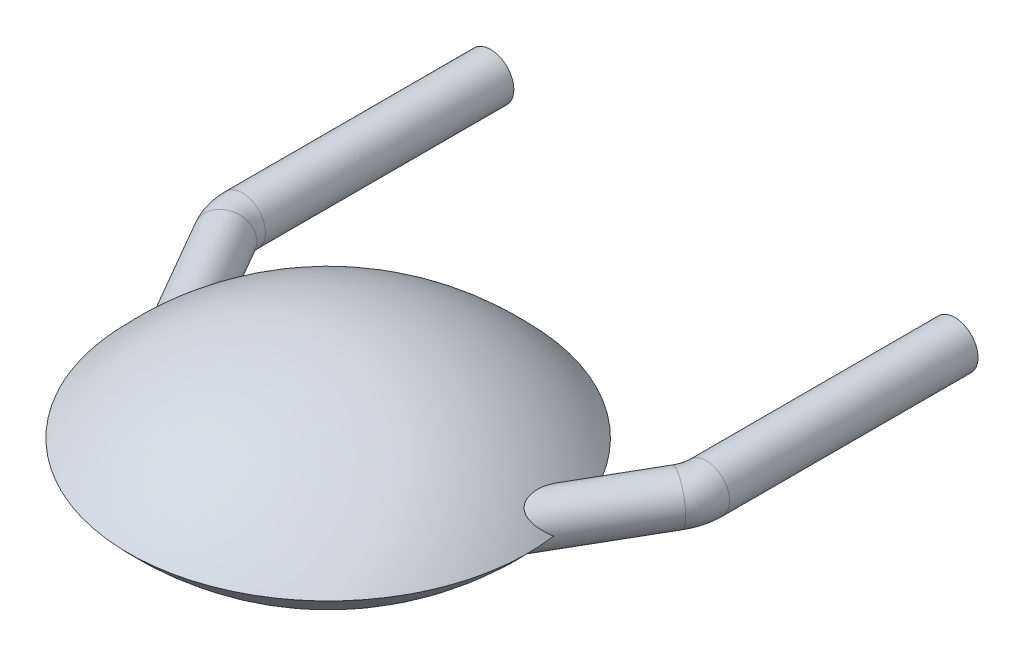
ISO-10303-21;
HEADER;
FILE_DESCRIPTION(('STEP AP214'),'2;1');
FILE_NAME('part.step','',(''),(''),'','','');
FILE_SCHEMA(('AUTOMOTIVE_DESIGN { 1 0 10303 214 1 1 1 1 }'));
ENDSEC;
DATA;
#1=APPLICATION_CONTEXT('core data for automotive mechanical design processes');
#2=APPLICATION_PROTOCOL_DEFINITION('international standard','automotive_design',2000,#1);
#3=PRODUCT_CONTEXT('',#1,'mechanical');
#4=PRODUCT('Part','Part','',(#3));
#5=PRODUCT_RELATED_PRODUCT_CATEGORY('part','',(#4));
#6=PRODUCT_DEFINITION_FORMATION('','',#4);
#7=PRODUCT_DEFINITION_CONTEXT('part definition',#1,'design');
#8=PRODUCT_DEFINITION('design','',#6,#7);
#9=PRODUCT_DEFINITION_SHAPE('','',#8);
#10=(LENGTH_UNIT() NAMED_UNIT(*) SI_UNIT(.MILLI.,.METRE.));
#11=(NAMED_UNIT(*) PLANE_ANGLE_UNIT() SI_UNIT($,.RADIAN.));
#12=(NAMED_UNIT(*) SI_UNIT($,.STERADIAN.) SOLID_ANGLE_UNIT());
#13=UNCERTAINTY_MEASURE_WITH_UNIT(LENGTH_MEASURE(1.E-05),#10,'distance_accuracy_value','');
#14=(GEOMETRIC_REPRESENTATION_CONTEXT(3) GLOBAL_UNCERTAINTY_ASSIGNED_CONTEXT((#13)) GLOBAL_UNIT_ASSIGNED_CONTEXT((#10,
#11,#12)) REPRESENTATION_CONTEXT('',''));
#15=CARTESIAN_POINT('',(0.,0.,0.));
#16=DIRECTION('',(0.,0.,1.));
#17=DIRECTION('',(1.,0.,0.));
#18=AXIS2_PLACEMENT_3D('',#15,#16,#17);
#19=CARTESIAN_POINT('',(0.,-0.25,-2.));
#20=DIRECTION('',(0.,0.,-1.));
#21=DIRECTION('',(-1.,0.,0.));
#22=AXIS2_PLACEMENT_3D('',#19,#20,#21);
#23=PLANE('',#22);
#24=CARTESIAN_POINT('',(0.,0.,-2.));
#25=DIRECTION('',(0.,0.,-1.));
#26=DIRECTION('',(-1.,0.,0.));
#27=AXIS2_PLACEMENT_3D('',#24,#25,#26);
#28=CIRCLE('',#27,0.25);
#29=CARTESIAN_POINT('',(-0.25,0.,-2.));
#30=VERTEX_POINT('',#29);
#31=EDGE_CURVE('E22',#30,#30,#28,.F.);
#32=ORIENTED_EDGE('',*,*,#31,.F.);
#33=EDGE_LOOP('',(#32));
#34=FACE_BOUND('',#33,.T.);
#35=ADVANCED_FACE('F17',(#34),#23,.T.);
#36=CARTESIAN_POINT('',(5.,0.25,-2.));
#37=DIRECTION('',(0.,0.,-1.));
#38=DIRECTION('',(-1.,0.,0.));
#39=AXIS2_PLACEMENT_3D('',#36,#37,#38);
#40=PLANE('',#39);
#41=CARTESIAN_POINT('',(5.,0.,-2.));
#42=DIRECTION('',(0.,0.,-1.));
#43=DIRECTION('',(-1.,0.,0.));
#44=AXIS2_PLACEMENT_3D('',#41,#42,#43);
#45=CIRCLE('',#44,0.25);
#46=CARTESIAN_POINT('',(4.75,0.,-2.));
#47=VERTEX_POINT('',#46);
#48=EDGE_CURVE('E82',#47,#47,#45,.F.);
#49=ORIENTED_EDGE('',*,*,#48,.F.);
#50=EDGE_LOOP('',(#49));
#51=FACE_BOUND('',#50,.T.);
#52=ADVANCED_FACE('F96',(#51),#40,.T.);
#53=CARTESIAN_POINT('',(0.,0.,-2.));
#54=DIRECTION('',(0.,0.,-1.));
#55=DIRECTION('',(-1.,0.,0.));
#56=AXIS2_PLACEMENT_3D('',#53,#54,#55);
#57=CYLINDRICAL_SURFACE('',#56,0.25);
#58=ORIENTED_EDGE('',*,*,#31,.T.);
#59=EDGE_LOOP('',(#58));
#60=FACE_BOUND('',#59,.T.);
#61=CARTESIAN_POINT('',(0.,0.,0.675));
#62=DIRECTION('',(0.,0.,-1.));
#63=DIRECTION('',(-1.,0.,0.));
#64=AXIS2_PLACEMENT_3D('',#61,#62,#63);
#65=CIRCLE('',#64,0.25);
#66=CARTESIAN_POINT('',(-0.25,0.,0.675));
#67=VERTEX_POINT('',#66);
#68=EDGE_CURVE('E215',#67,#67,#65,.T.);
#69=ORIENTED_EDGE('',*,*,#68,.T.);
#70=EDGE_LOOP('',(#69));
#71=FACE_BOUND('',#70,.T.);
#72=ADVANCED_FACE('F99',(#60,#71),#57,.T.);
#73=CARTESIAN_POINT('',(5.,0.,-2.));
#74=DIRECTION('',(0.,0.,-1.));
#75=DIRECTION('',(-1.,0.,0.));
#76=AXIS2_PLACEMENT_3D('',#73,#74,#75);
#77=CYLINDRICAL_SURFACE('',#76,0.25);
#78=ORIENTED_EDGE('',*,*,#48,.T.);
#79=EDGE_LOOP('',(#78));
#80=FACE_BOUND('',#79,.T.);
#81=CARTESIAN_POINT('',(5.,0.,0.675));
#82=DIRECTION('',(0.,0.,-1.));
#83=DIRECTION('',(-1.,0.,0.));
#84=AXIS2_PLACEMENT_3D('',#81,#82,#83);
#85=CIRCLE('',#84,0.25);
#86=CARTESIAN_POINT('',(5.25,0.,0.675));
#87=VERTEX_POINT('',#86);
#88=EDGE_CURVE('E218',#87,#87,#85,.T.);
#89=ORIENTED_EDGE('',*,*,#88,.T.);
#90=EDGE_LOOP('',(#89));
#91=FACE_BOUND('',#90,.T.);
#92=ADVANCED_FACE('F76',(#80,#91),#77,.T.);
#93=CARTESIAN_POINT('',(0.500000000000002,0.,0.675));
#94=DIRECTION('',(0.,-1.,0.));
#95=DIRECTION('',(1.,0.,0.));
#96=AXIS2_PLACEMENT_3D('',#93,#94,#95);
#97=TOROIDAL_SURFACE('',#96,0.500000000000002,0.25);
#98=CARTESIAN_POINT('',(0.06698729810778,0.,0.925));
#99=DIRECTION('',(-0.50000000000019,0.,-0.866025403784329));
#100=DIRECTION('',(-0.866025403784329,0.,0.50000000000019));
#101=AXIS2_PLACEMENT_3D('',#98,#99,#100);
#102=CIRCLE('',#101,0.25);
#103=CARTESIAN_POINT('',(-0.14951905283833,0.,1.05));
#104=VERTEX_POINT('',#103);
#105=EDGE_CURVE('E221',#104,#104,#102,.F.);
#106=CARTESIAN_POINT('',(0.500000000000002,0.,0.675));
#107=DIRECTION('',(0.,-1.,0.));
#108=DIRECTION('',(1.,0.,0.));
#109=AXIS2_PLACEMENT_3D('',#106,#107,#108);
#110=CIRCLE('',#109,0.750000000000002);
#111=EDGE_CURVE('',#104,#67,#110,.T.);
#112=ORIENTED_EDGE('',*,*,#105,.F.);
#113=ORIENTED_EDGE('',*,*,#68,.F.);
#114=ORIENTED_EDGE('',*,*,#111,.T.);
#115=ORIENTED_EDGE('',*,*,#111,.F.);
#116=EDGE_LOOP('',(#112,#114,#113,#115));
#117=FACE_BOUND('',#116,.T.);
#118=ADVANCED_FACE('F89',(#117),#97,.T.);
#119=CARTESIAN_POINT('',(4.5,0.,0.675));
#120=DIRECTION('',(0.,1.,0.));
#121=DIRECTION('',(-1.,0.,0.));
#122=AXIS2_PLACEMENT_3D('',#119,#120,#121);
#123=TOROIDAL_SURFACE('',#122,0.499999999999999,0.25);
#124=CARTESIAN_POINT('',(4.933012701892,0.,0.925));
#125=DIRECTION('',(0.50000000000019,0.,-0.866025403784329));
#126=DIRECTION('',(-0.866025403784329,0.,-0.50000000000019));
#127=AXIS2_PLACEMENT_3D('',#124,#125,#126);
#128=CIRCLE('',#127,0.25);
#129=CARTESIAN_POINT('',(5.14951905283825,0.,1.05000000000014));
#130=VERTEX_POINT('',#129);
#131=EDGE_CURVE('E50',#130,#130,#128,.F.);
#132=CARTESIAN_POINT('',(4.5,0.,0.675));
#133=DIRECTION('',(0.,1.,0.));
#134=DIRECTION('',(-1.,0.,0.));
#135=AXIS2_PLACEMENT_3D('',#132,#133,#134);
#136=CIRCLE('',#135,0.749999999999999);
#137=EDGE_CURVE('',#130,#87,#136,.T.);
#138=ORIENTED_EDGE('',*,*,#131,.F.);
#139=ORIENTED_EDGE('',*,*,#88,.F.);
#140=ORIENTED_EDGE('',*,*,#137,.T.);
#141=ORIENTED_EDGE('',*,*,#137,.F.);
#142=EDGE_LOOP('',(#138,#140,#139,#141));
#143=FACE_BOUND('',#142,.T.);
#144=ADVANCED_FACE('F73',(#143),#123,.T.);
#145=CARTESIAN_POINT('',(0.06698729810778,0.,0.925));
#146=DIRECTION('',(-0.50000000000019,0.,-0.866025403784329));
#147=DIRECTION('',(-0.866025403784329,0.,0.50000000000019));
#148=AXIS2_PLACEMENT_3D('',#145,#146,#147);
#149=CYLINDRICAL_SURFACE('',#148,0.25);
#150=ORIENTED_EDGE('',*,*,#105,.T.);
#151=EDGE_LOOP('',(#150));
#152=FACE_BOUND('',#151,.T.);
#153=CARTESIAN_POINT('',(0.571683814519313,0.,1.29916000882754));
#154=CARTESIAN_POINT('',(0.577460441339772,0.0105570114717779,1.30918285262704));
#155=CARTESIAN_POINT('',(0.582811357541021,0.0207803100266471,1.31976908121807));
#156=CARTESIAN_POINT('',(0.592747168201653,0.0405442986127378,1.34185712685735));
#157=CARTESIAN_POINT('',(0.597333549016134,0.0500862920331602,1.35335710160693));
#158=CARTESIAN_POINT('',(0.61005639220912,0.0776232273582537,1.3888402308135));
#159=CARTESIAN_POINT('',(0.617219803517886,0.0946485981343954,1.41392451423475));
#160=CARTESIAN_POINT('',(0.632517485601851,0.134114879259679,1.47925756488592));
#161=CARTESIAN_POINT('',(0.63931783334054,0.154953709494277,1.52077156410287));
#162=CARTESIAN_POINT('',(0.648996821237423,0.191087140131232,1.6067848328957));
#163=CARTESIAN_POINT('',(0.651856282173335,0.206354362308329,1.65129760385874));
#164=CARTESIAN_POINT('',(0.653184405468283,0.226773176185103,1.72716911138032));
#165=CARTESIAN_POINT('',(0.652783122852926,0.23360007145336,1.75806936429753));
#166=CARTESIAN_POINT('',(0.649711407335466,0.244044974491347,1.82019656667861));
#167=CARTESIAN_POINT('',(0.647053433417894,0.247680378478458,1.85142079438859));
#168=CARTESIAN_POINT('',(0.640852710607261,0.249871064880682,1.89591309310705));
#169=CARTESIAN_POINT('',(0.638673969340392,0.250139939836162,1.9092889295095));
#170=CARTESIAN_POINT('',(0.63349604281854,0.249718415664703,1.93592482163474));
#171=CARTESIAN_POINT('',(0.630494174563593,0.249024848885979,1.94918434980543));
#172=CARTESIAN_POINT('',(0.623359904864363,0.246398773520815,1.97549224852601));
#173=CARTESIAN_POINT('',(0.619211772572879,0.244448482005232,1.98853478701066));
#174=CARTESIAN_POINT('',(0.609378011329235,0.238857531555122,2.01363883156748));
#175=CARTESIAN_POINT('',(0.603702787817046,0.235228197274378,2.02570628353809));
#176=CARTESIAN_POINT('',(0.593835585596761,0.22822951883194,2.04193090290993));
#177=CARTESIAN_POINT('',(0.590420617133286,0.225717252858077,2.04692391814113));
#178=CARTESIAN_POINT('',(0.583109114776669,0.220147496516248,2.05620717557635));
#179=CARTESIAN_POINT('',(0.579213110471681,0.217090604130988,2.06049817875435));
#180=CARTESIAN_POINT('',(0.57094081853291,0.210415408637545,2.06818423160408));
#181=CARTESIAN_POINT('',(0.56656067023542,0.206792480856961,2.07157121556753));
#182=CARTESIAN_POINT('',(0.557473980836755,0.199101604810199,2.0772151247966));
#183=CARTESIAN_POINT('',(0.552767486478832,0.195033720228144,2.07947221152075));
#184=CARTESIAN_POINT('',(0.543660688359279,0.187010964222561,2.08265778672387));
#185=CARTESIAN_POINT('',(0.539273603463936,0.18308187930405,2.0836918622471));
#186=CARTESIAN_POINT('',(0.530495517738036,0.175101605536029,2.08487550293355));
#187=CARTESIAN_POINT('',(0.526104516055285,0.171050354661675,2.08502461092377));
#188=CARTESIAN_POINT('',(0.514894979198893,0.160567690012325,2.0844254791657));
#189=CARTESIAN_POINT('',(0.50813424976936,0.154108746191402,2.08311120724786));
#190=CARTESIAN_POINT('',(0.494956731767916,0.141278591057944,2.07907912462604));
#191=CARTESIAN_POINT('',(0.488541098195809,0.134907721688273,2.07635688956573));
#192=CARTESIAN_POINT('',(0.470998168722308,0.117171985157404,2.06725912990579));
#193=CARTESIAN_POINT('',(0.460308345458277,0.105983763785322,2.05971655552693));
#194=CARTESIAN_POINT('',(0.440057216310016,0.0841091059322988,2.04262168372363));
#195=CARTESIAN_POINT('',(0.430501341500745,0.0734252211572255,2.03306027951264));
#196=CARTESIAN_POINT('',(0.411910209443321,0.0519408152999395,2.01204584109505));
#197=CARTESIAN_POINT('',(0.402931269465749,0.0411653767270791,2.0005183530837));
#198=CARTESIAN_POINT('',(0.386113395310195,0.0202036641363558,1.97653561608621));
#199=CARTESIAN_POINT('',(0.378259861511266,0.0100111261994867,1.96409618216529));
#200=CARTESIAN_POINT('',(0.370849630507113,1.74105648832137E-13,1.95130499822157));
#201=B_SPLINE_CURVE_WITH_KNOTS('',3,(#153,#154,#155,#156,#157,#158,#159,#160,#161,#162,#163,
#164,#165,#166,#167,#168,#169,#170,#171,#172,#173,#174,#175,#176,#177,#178,#179,#180,#181,#182,
#183,#184,#185,#186,#187,#188,#189,#190,#191,#192,#193,#194,#195,#196,#197,#198,#199,#200),
.UNSPECIFIED.,.F.,.F.,(4,2,2,2,2,2,2,2,2,2,2,2,2,2,2,2,2,2,2,2,2,2,2,4),(0.,0.0469318831569807,
0.0937714328095949,0.186918719969168,0.327066083585748,0.467893126044458,0.562668430061546,
0.656923865585329,0.697547418940361,0.738304992792809,0.779652350835991,0.820724810050473,
0.840312600538886,0.859879015320492,0.879614571627151,0.899347306983294,0.917211121325151,
0.935084163285821,0.963246885069929,0.991498647430984,1.04285428389769,1.09444672963954,
1.14883641656182,1.20244008835962),.UNSPECIFIED.);
#202=CARTESIAN_POINT('',(0.57168381451933,0.,1.29916000882757));
#203=VERTEX_POINT('',#202);
#204=CARTESIAN_POINT('',(0.370849630507088,0.,1.95130499822153));
#205=VERTEX_POINT('',#204);
#206=EDGE_CURVE('E44',#203,#205,#201,.T.);
#207=ORIENTED_EDGE('',*,*,#206,.F.);
#208=CARTESIAN_POINT('',(0.370849630507114,-1.76043001004129E-13,1.95130499822157));
#209=CARTESIAN_POINT('',(0.376269408101634,-0.00732456573531799,1.96068157438183));
#210=CARTESIAN_POINT('',(0.381929733948354,-0.0147477430553627,1.96985169245245));
#211=CARTESIAN_POINT('',(0.393789576323027,-0.029842536470418,1.98769824715667));
#212=CARTESIAN_POINT('',(0.399991145502324,-0.0375150223606686,1.99637257788285));
#213=CARTESIAN_POINT('',(0.413018094886205,-0.0531848284135658,2.01315938558472));
#214=CARTESIAN_POINT('',(0.41984941732469,-0.0611847384995319,2.02126489184985));
#215=CARTESIAN_POINT('',(0.434122630200468,-0.0774522975028724,2.03659814053238));
#216=CARTESIAN_POINT('',(0.441563406453532,-0.0857194418249285,2.04382742734655));
#217=CARTESIAN_POINT('',(0.454935577191388,-0.100190692701145,2.05522264006224));
#218=CARTESIAN_POINT('',(0.460700924100218,-0.10631916569497,2.05967754214504));
#219=CARTESIAN_POINT('',(0.472613643135632,-0.118747530937586,2.06778122536523));
#220=CARTESIAN_POINT('',(0.478761024034569,-0.125047427120767,2.07142998798307));
#221=CARTESIAN_POINT('',(0.491520797005017,-0.13787713080778,2.07767450683649));
#222=CARTESIAN_POINT('',(0.498137727837206,-0.144408750212944,2.08025765645991));
#223=CARTESIAN_POINT('',(0.511719264079141,-0.157544741742417,2.08386996258176));
#224=CARTESIAN_POINT('',(0.518682699243948,-0.164148817129195,2.08490402568766));
#225=CARTESIAN_POINT('',(0.530322797362792,-0.174944311649358,2.08489210289471));
#226=CARTESIAN_POINT('',(0.534956735104281,-0.179179628974929,2.08444218908528));
#227=CARTESIAN_POINT('',(0.544175049671853,-0.18747035242354,2.08252334508855));
#228=CARTESIAN_POINT('',(0.54875947828149,-0.191525963862873,2.08105561147434));
#229=CARTESIAN_POINT('',(0.557753974681271,-0.199339414625625,2.0770471886218));
#230=CARTESIAN_POINT('',(0.562163129663484,-0.203095777128087,2.0745015277071));
#231=CARTESIAN_POINT('',(0.570640077472713,-0.210166762037932,2.06842027265004));
#232=CARTESIAN_POINT('',(0.574707653515527,-0.213481104688977,2.06488405592825));
#233=CARTESIAN_POINT('',(0.583077915639451,-0.220133158643387,2.05632342247862));
#234=CARTESIAN_POINT('',(0.587299758792375,-0.223375930065715,2.05114743275255));
#235=CARTESIAN_POINT('',(0.595132259353764,-0.229178866008072,2.04001244205746));
#236=CARTESIAN_POINT('',(0.598741711441038,-0.231737689932664,2.03405193699098));
#237=CARTESIAN_POINT('',(0.607344418770507,-0.237559806646036,2.01800234355761));
#238=CARTESIAN_POINT('',(0.611920899253187,-0.240366736382251,2.00752892736867));
#239=CARTESIAN_POINT('',(0.619998753753603,-0.244799205650183,1.98594452991157));
#240=CARTESIAN_POINT('',(0.623497003066415,-0.246421329891412,1.97483180433814));
#241=CARTESIAN_POINT('',(0.632706192036174,-0.249889736747035,1.94130917500018));
#242=CARTESIAN_POINT('',(0.637247952635873,-0.250411885850075,1.91845087299613));
#243=CARTESIAN_POINT('',(0.644373164693715,-0.249040226511647,1.87253048047183));
#244=CARTESIAN_POINT('',(0.64695145388597,-0.247140084287327,1.84946801292065));
#245=CARTESIAN_POINT('',(0.650604175398518,-0.241554646022676,1.80446291694159));
#246=CARTESIAN_POINT('',(0.65173873051625,-0.237949965888739,1.7825149297013));
#247=CARTESIAN_POINT('',(0.652948804302311,-0.229229274991919,1.73888492747546));
#248=CARTESIAN_POINT('',(0.653023447640703,-0.22411201862482,1.71720314709825));
#249=CARTESIAN_POINT('',(0.651851255122613,-0.206668235722967,1.65262575875615));
#250=CARTESIAN_POINT('',(0.649201522825008,-0.192263733994049,1.61030055450419));
#251=CARTESIAN_POINT('',(0.6400939560422,-0.157472445202721,1.52611061658839));
#252=CARTESIAN_POINT('',(0.633456880864755,-0.136828392973807,1.48436878108428));
#253=CARTESIAN_POINT('',(0.619980441653256,-0.10165340858454,1.42526780924222));
#254=CARTESIAN_POINT('',(0.614921925745433,-0.0892704035743422,1.40620486943604));
#255=CARTESIAN_POINT('',(0.60344112948358,-0.0630615267645895,1.36955110192667));
#256=CARTESIAN_POINT('',(0.597021158997162,-0.0492381187327584,1.35195785032415));
#257=CARTESIAN_POINT('',(0.587026993150138,-0.0291253560978209,1.32901335842484));
#258=CARTESIAN_POINT('',(0.584143057913995,-0.0234538336011011,1.32281025579746));
#259=CARTESIAN_POINT('',(0.578114016795404,-0.0118907280759699,1.31072884551395));
#260=CARTESIAN_POINT('',(0.574968582319525,-0.00599887345601209,1.30485096244324));
#261=CARTESIAN_POINT('',(0.571683814527719,-8.14940441146384E-12,1.29916000881677));
#262=B_SPLINE_CURVE_WITH_KNOTS('',3,(#208,#209,#210,#211,#212,#213,#214,#215,#216,#217,#218,
#219,#220,#221,#222,#223,#224,#225,#226,#227,#228,#229,#230,#231,#232,#233,#234,#235,#236,#237,
#238,#239,#240,#241,#242,#243,#244,#245,#246,#247,#248,#249,#250,#251,#252,#253,#254,#255,#256,
#257,#258,#259,#260,#261),.UNSPECIFIED.,.F.,.F.,(4,2,2,2,2,2,2,2,2,2,2,2,2,2,2,2,2,2,2,2,2,2,2,
2,2,2,4),(0.,0.0392297758877094,0.0786153952816292,0.118420635247934,0.158154662744273,
0.186684094558361,0.215214181714081,0.244072728466981,0.272839673375663,0.291649691338457,
0.310437633204051,0.329313190302873,0.348200637699585,0.370352042080839,0.392546551893864,
0.42765464335132,0.462863541359083,0.532408973626536,0.602136626135849,0.668853791823888,
0.735626052794636,0.86947803595485,1.0098512673733,1.07961967984578,1.14927065571632,
1.17591830194269,1.20259995426557),.UNSPECIFIED.);
#263=EDGE_CURVE('E46',#205,#203,#262,.T.);
#264=ORIENTED_EDGE('',*,*,#263,.F.);
#265=EDGE_LOOP('',(#207,#264));
#266=FACE_BOUND('',#265,.T.);
#267=ADVANCED_FACE('F48',(#152,#266),#149,.T.);
#268=CARTESIAN_POINT('',(4.933012701892,0.,0.925));
#269=DIRECTION('',(0.50000000000019,0.,-0.866025403784329));
#270=DIRECTION('',(-0.866025403784329,0.,-0.50000000000019));
#271=AXIS2_PLACEMENT_3D('',#268,#269,#270);
#272=CYLINDRICAL_SURFACE('',#271,0.25);
#273=ORIENTED_EDGE('',*,*,#131,.T.);
#274=EDGE_LOOP('',(#273));
#275=FACE_BOUND('',#274,.T.);
#276=CARTESIAN_POINT('',(4.62915036949281,2.24747539001935E-13,1.95130499822133));
#277=CARTESIAN_POINT('',(4.62373059189829,0.00732456573536555,1.96068157438159));
#278=CARTESIAN_POINT('',(4.61807026605157,0.0147477430554099,1.9698516924522));
#279=CARTESIAN_POINT('',(4.6062104236769,0.0298425364704648,1.98769824715641));
#280=CARTESIAN_POINT('',(4.6000088544976,0.0375150223607153,1.99637257788259));
#281=CARTESIAN_POINT('',(4.58698190511372,0.0531848284136117,2.01315938558445));
#282=CARTESIAN_POINT('',(4.58015058267524,0.061184738499577,2.02126489184957));
#283=CARTESIAN_POINT('',(4.56587736979946,0.0774522975029154,2.0365981405321));
#284=CARTESIAN_POINT('',(4.5584365935464,0.0857194418249704,2.04382742734627));
#285=CARTESIAN_POINT('',(4.54506442280854,0.100190692701186,2.05522264006194));
#286=CARTESIAN_POINT('',(4.53929907589971,0.106319165695011,2.05967754214475));
#287=CARTESIAN_POINT('',(4.5273863568643,0.118747530937627,2.06778122536492));
#288=CARTESIAN_POINT('',(4.52123897596536,0.125047427120808,2.07142998798277));
#289=CARTESIAN_POINT('',(4.50847920299491,0.137877130807821,2.07767450683618));
#290=CARTESIAN_POINT('',(4.50186227216273,0.144408750212984,2.08025765645959));
#291=CARTESIAN_POINT('',(4.48828073592079,0.157544741742455,2.08386996258144));
#292=CARTESIAN_POINT('',(4.48131730075599,0.164148817129231,2.08490402568734));
#293=CARTESIAN_POINT('',(4.46967720263714,0.174944311649393,2.08489210289437));
#294=CARTESIAN_POINT('',(4.46504326489565,0.179179628974964,2.08444218908495));
#295=CARTESIAN_POINT('',(4.45582495032808,0.187470352423575,2.08252334508821));
#296=CARTESIAN_POINT('',(4.45124052171844,0.191525963862907,2.081055611474));
#297=CARTESIAN_POINT('',(4.44224602531866,0.199339414625658,2.07704718862145));
#298=CARTESIAN_POINT('',(4.43783687033645,0.20309577712812,2.07450152770675));
#299=CARTESIAN_POINT('',(4.42935992252722,0.210166762037963,2.06842027264969));
#300=CARTESIAN_POINT('',(4.4252923464844,0.213481104689007,2.06488405592789));
#301=CARTESIAN_POINT('',(4.41692208436048,0.220133158643415,2.05632342247826));
#302=CARTESIAN_POINT('',(4.41270024120755,0.223375930065744,2.05114743275218));
#303=CARTESIAN_POINT('',(4.40486774064616,0.229178866008099,2.04001244205709));
#304=CARTESIAN_POINT('',(4.40125828855889,0.231737689932691,2.0340519369906));
#305=CARTESIAN_POINT('',(4.39265558122942,0.237559806646061,2.01800234355721));
#306=CARTESIAN_POINT('',(4.38807910074673,0.240366736382275,2.00752892736827));
#307=CARTESIAN_POINT('',(4.38000124624631,0.244799205650203,1.98594452991115));
#308=CARTESIAN_POINT('',(4.3765029969335,0.24642132989143,1.97483180433771));
#309=CARTESIAN_POINT('',(4.36729380796374,0.249889736747043,1.94130917499972));
#310=CARTESIAN_POINT('',(4.36275204736404,0.250411885850077,1.91845087299566));
#311=CARTESIAN_POINT('',(4.3556268353062,0.249040226511633,1.87253048047133));
#312=CARTESIAN_POINT('',(4.35304854611394,0.247140084287304,1.84946801292013));
#313=CARTESIAN_POINT('',(4.3493958246014,0.241554646022635,1.80446291694106));
#314=CARTESIAN_POINT('',(4.34826126948367,0.23794996588869,1.78251492970076));
#315=CARTESIAN_POINT('',(4.34705119569762,0.229229274991854,1.73888492747491));
#316=CARTESIAN_POINT('',(4.34697655235922,0.224112018624746,1.7172031470977));
#317=CARTESIAN_POINT('',(4.34814874487732,0.206668235722867,1.65262575875559));
#318=CARTESIAN_POINT('',(4.35079847717493,0.192263733993931,1.61030055450363));
#319=CARTESIAN_POINT('',(4.35990604395776,0.157472445202566,1.52611061658783));
#320=CARTESIAN_POINT('',(4.36654311913521,0.136828392973633,1.48436878108373));
#321=CARTESIAN_POINT('',(4.38001955834673,0.101653408584338,1.42526780924168));
#322=CARTESIAN_POINT('',(4.38507807425456,0.0892704035741313,1.40620486943551));
#323=CARTESIAN_POINT('',(4.39655887051643,0.0630615267643599,1.36955110192616));
#324=CARTESIAN_POINT('',(4.40297884100285,0.0492381187325195,1.35195785032365));
#325=CARTESIAN_POINT('',(4.41297300684986,0.0291253560976253,1.32901335842442));
#326=CARTESIAN_POINT('',(4.41585694208598,0.0234538336009605,1.32281025579711));
#327=CARTESIAN_POINT('',(4.42188598320451,0.0118907280759435,1.31072884551372));
#328=CARTESIAN_POINT('',(4.42503141768036,0.00599887345604507,1.30485096244307));
#329=CARTESIAN_POINT('',(4.42831618547213,8.24389718607959E-12,1.29916000881665));
#330=B_SPLINE_CURVE_WITH_KNOTS('',3,(#276,#277,#278,#279,#280,#281,#282,#283,#284,#285,#286,
#287,#288,#289,#290,#291,#292,#293,#294,#295,#296,#297,#298,#299,#300,#301,#302,#303,#304,#305,
#306,#307,#308,#309,#310,#311,#312,#313,#314,#315,#316,#317,#318,#319,#320,#321,#322,#323,#324,
#325,#326,#327,#328,#329),.UNSPECIFIED.,.F.,.F.,(4,2,2,2,2,2,2,2,2,2,2,2,2,2,2,2,2,2,2,2,2,2,2,
2,2,2,4),(0.,0.0392297758877,0.0786153952816106,0.118420635247906,0.158154662744235,
0.186684094558318,0.215214181714034,0.244072728466929,0.272839673375605,0.291649691338401,
0.310437633203997,0.329313190302822,0.348200637699534,0.370352042080798,0.392546551893836,
0.427654643351315,0.462863541359103,0.532408973626605,0.602136626135966,0.66885379182402,
0.735626052794782,0.869478035955025,1.00985126737348,1.07961967984596,1.1492706557165,
1.17591830194261,1.20259995426521),.UNSPECIFIED.);
#331=CARTESIAN_POINT('',(4.62915036949284,0.,1.95130499822128));
#332=VERTEX_POINT('',#331);
#333=CARTESIAN_POINT('',(4.42831618548054,0.,1.29916000882742));
#334=VERTEX_POINT('',#333);
#335=EDGE_CURVE('E28',#332,#334,#330,.T.);
#336=ORIENTED_EDGE('',*,*,#335,.F.);
#337=CARTESIAN_POINT('',(4.42831618548056,0.,1.29916000882739));
#338=CARTESIAN_POINT('',(4.4225395586601,-0.0105570114718367,1.3091828526269));
#339=CARTESIAN_POINT('',(4.41718864245885,-0.020780310026707,1.31976908121792));
#340=CARTESIAN_POINT('',(4.40725283179822,-0.0405442986127996,1.34185712685722));
#341=CARTESIAN_POINT('',(4.40266645098374,-0.0500862920332227,1.3533571016068));
#342=CARTESIAN_POINT('',(4.38994360779076,-0.0776232273583185,1.38884023081338));
#343=CARTESIAN_POINT('',(4.38278019648199,-0.0946485981344615,1.41392451423463));
#344=CARTESIAN_POINT('',(4.36748251439804,-0.134114879259742,1.47925756488581));
#345=CARTESIAN_POINT('',(4.36068216665935,-0.154953709494335,1.52077156410277));
#346=CARTESIAN_POINT('',(4.35100317876248,-0.191087140131282,1.6067848328956));
#347=CARTESIAN_POINT('',(4.34814371782658,-0.206354362308375,1.65129760385864));
#348=CARTESIAN_POINT('',(4.34681559453165,-0.22677317618513,1.72716911138018));
#349=CARTESIAN_POINT('',(4.34721687714701,-0.233600071453376,1.75806936429736));
#350=CARTESIAN_POINT('',(4.35028859266447,-0.244044974491349,1.82019656667837));
#351=CARTESIAN_POINT('',(4.35294656658205,-0.247680378478456,1.85142079438831));
#352=CARTESIAN_POINT('',(4.35914728939268,-0.249871064880682,1.89591309310675));
#353=CARTESIAN_POINT('',(4.36132603065955,-0.250139939836162,1.90928892950922));
#354=CARTESIAN_POINT('',(4.36650395718142,-0.249718415664702,1.93592482163449));
#355=CARTESIAN_POINT('',(4.36950582543637,-0.249024848885975,1.94918434980519));
#356=CARTESIAN_POINT('',(4.37664009513562,-0.246398773520802,1.9754922485258));
#357=CARTESIAN_POINT('',(4.38078822742712,-0.244448482005213,1.98853478701047));
#358=CARTESIAN_POINT('',(4.39062198867079,-0.238857531555082,2.01363883156732));
#359=CARTESIAN_POINT('',(4.396297212183,-0.235228197274325,2.02570628353794));
#360=CARTESIAN_POINT('',(4.40616441440331,-0.228229518831865,2.04193090290976));
#361=CARTESIAN_POINT('',(4.40957938286679,-0.225717252857998,2.04692391814096));
#362=CARTESIAN_POINT('',(4.41689088522341,-0.220147496516161,2.05620717557616));
#363=CARTESIAN_POINT('',(4.4207868895284,-0.217090604130897,2.06049817875414));
#364=CARTESIAN_POINT('',(4.42905918146718,-0.210415408637448,2.06818423160385));
#365=CARTESIAN_POINT('',(4.43343932976467,-0.206792480856862,2.07157121556729));
#366=CARTESIAN_POINT('',(4.44252601916333,-0.199101604810097,2.07721512479634));
#367=CARTESIAN_POINT('',(4.44723251352126,-0.195033720228042,2.07947221152047));
#368=CARTESIAN_POINT('',(4.45633931164081,-0.187010964222457,2.08265778672357));
#369=CARTESIAN_POINT('',(4.46072639653615,-0.183081879303944,2.0836918622468));
#370=CARTESIAN_POINT('',(4.46950448226205,-0.175101605535921,2.08487550293323));
#371=CARTESIAN_POINT('',(4.4738954839448,-0.171050354661567,2.08502461092344));
#372=CARTESIAN_POINT('',(4.48510502080121,-0.160567690012204,2.08442547916535));
#373=CARTESIAN_POINT('',(4.49186575023075,-0.154108746191268,2.08311120724749));
#374=CARTESIAN_POINT('',(4.50504326823222,-0.141278591057786,2.07907912462565));
#375=CARTESIAN_POINT('',(4.51145890180433,-0.134907721688103,2.07635688956533));
#376=CARTESIAN_POINT('',(4.52900183127787,-0.117171985157194,2.06725912990534));
#377=CARTESIAN_POINT('',(4.53969165454192,-0.105983763785085,2.05971655552644));
#378=CARTESIAN_POINT('',(4.55994278369021,-0.0841091059320095,2.04262168372306));
#379=CARTESIAN_POINT('',(4.5694986584995,-0.0734252211569112,2.03306027951203));
#380=CARTESIAN_POINT('',(4.58808979055687,-0.0519408152996699,2.01204584109446));
#381=CARTESIAN_POINT('',(4.59706873053438,-0.041165376726875,2.00051835308316));
#382=CARTESIAN_POINT('',(4.61388660468983,-0.0202036641362748,1.9765356160858));
#383=CARTESIAN_POINT('',(4.62174013848871,-0.0100111261994636,1.96409618216495));
#384=CARTESIAN_POINT('',(4.62915036949282,-2.07069164209145E-13,1.95130499822131));
#385=B_SPLINE_CURVE_WITH_KNOTS('',3,(#337,#338,#339,#340,#341,#342,#343,#344,#345,#346,#347,
#348,#349,#350,#351,#352,#353,#354,#355,#356,#357,#358,#359,#360,#361,#362,#363,#364,#365,#366,
#367,#368,#369,#370,#371,#372,#373,#374,#375,#376,#377,#378,#379,#380,#381,#382,#383,#384),
.UNSPECIFIED.,.F.,.F.,(4,2,2,2,2,2,2,2,2,2,2,2,2,2,2,2,2,2,2,2,2,2,2,4),(0.,0.046931883156989,
0.0937714328096117,0.186918719969203,0.327066083585778,0.467893126044483,0.562668430061461,
0.656923865585135,0.697547418940216,0.738304992792716,0.779652350835955,0.82072481005049,
0.84031260053889,0.859879015320486,0.879614571627132,0.899347306983262,0.917211121325119,
0.935084163285789,0.963246885069951,0.991498647431063,1.0428542838979,1.09444672963989,
1.14883641656186,1.20244008835935),.UNSPECIFIED.);
#386=EDGE_CURVE('E35',#334,#332,#385,.T.);
#387=ORIENTED_EDGE('',*,*,#386,.F.);
#388=EDGE_LOOP('',(#336,#387));
#389=FACE_BOUND('',#388,.T.);
#390=ADVANCED_FACE('F72',(#275,#389),#272,.T.);
#391=CARTESIAN_POINT('',(2.5,1.957894736842,2.25));
#392=DIRECTION('',(-1.,0.,0.));
#393=DIRECTION('',(0.,-0.663540696898644,-0.748140189776797));
#394=AXIS2_PLACEMENT_3D('',#391,#392,#393);
#395=SPHERICAL_SURFACE('',#394,2.907894736842);
#396=CARTESIAN_POINT('',(2.5,0.,2.25));
#397=DIRECTION('',(0.,1.,0.));
#398=DIRECTION('',(-1.,0.,0.));
#399=AXIS2_PLACEMENT_3D('',#396,#397,#398);
#400=CIRCLE('',#399,2.14999999999995);
#401=EDGE_CURVE('E11',#334,#203,#400,.T.);
#402=ORIENTED_EDGE('',*,*,#401,.F.);
#403=ORIENTED_EDGE('',*,*,#386,.T.);
#404=CARTESIAN_POINT('',(2.5,0.,2.25));
#405=DIRECTION('',(0.,1.,0.));
#406=DIRECTION('',(-1.,0.,0.));
#407=AXIS2_PLACEMENT_3D('',#404,#405,#406);
#408=CIRCLE('',#407,2.14999999999995);
#409=EDGE_CURVE('E53',#205,#332,#408,.T.);
#410=ORIENTED_EDGE('',*,*,#409,.F.);
#411=ORIENTED_EDGE('',*,*,#263,.T.);
#412=EDGE_LOOP('',(#402,#403,#410,#411));
#413=FACE_BOUND('',#412,.T.);
#414=ADVANCED_FACE('F54',(#413),#395,.T.);
#415=CARTESIAN_POINT('',(2.5,-1.957894736842,2.25));
#416=DIRECTION('',(-1.,0.,0.));
#417=DIRECTION('',(0.,0.663514057464368,0.74816381598362));
#418=AXIS2_PLACEMENT_3D('',#415,#416,#417);
#419=SPHERICAL_SURFACE('',#418,2.907894736842);
#420=ORIENTED_EDGE('',*,*,#335,.T.);
#421=ORIENTED_EDGE('',*,*,#401,.T.);
#422=ORIENTED_EDGE('',*,*,#206,.T.);
#423=ORIENTED_EDGE('',*,*,#409,.T.);
#424=EDGE_LOOP('',(#420,#421,#422,#423));
#425=FACE_BOUND('',#424,.T.);
#426=ADVANCED_FACE('F19',(#425),#419,.T.);
#427=CLOSED_SHELL('',(#35,#52,#72,#92,#118,#144,#267,#390,#414,#426));
#428=MANIFOLD_SOLID_BREP('B1',#427);
#429=ADVANCED_BREP_SHAPE_REPRESENTATION('',(#18,#428),#14);
#430=SHAPE_DEFINITION_REPRESENTATION(#9,#429);
ENDSEC;
END-ISO-10303-21;
